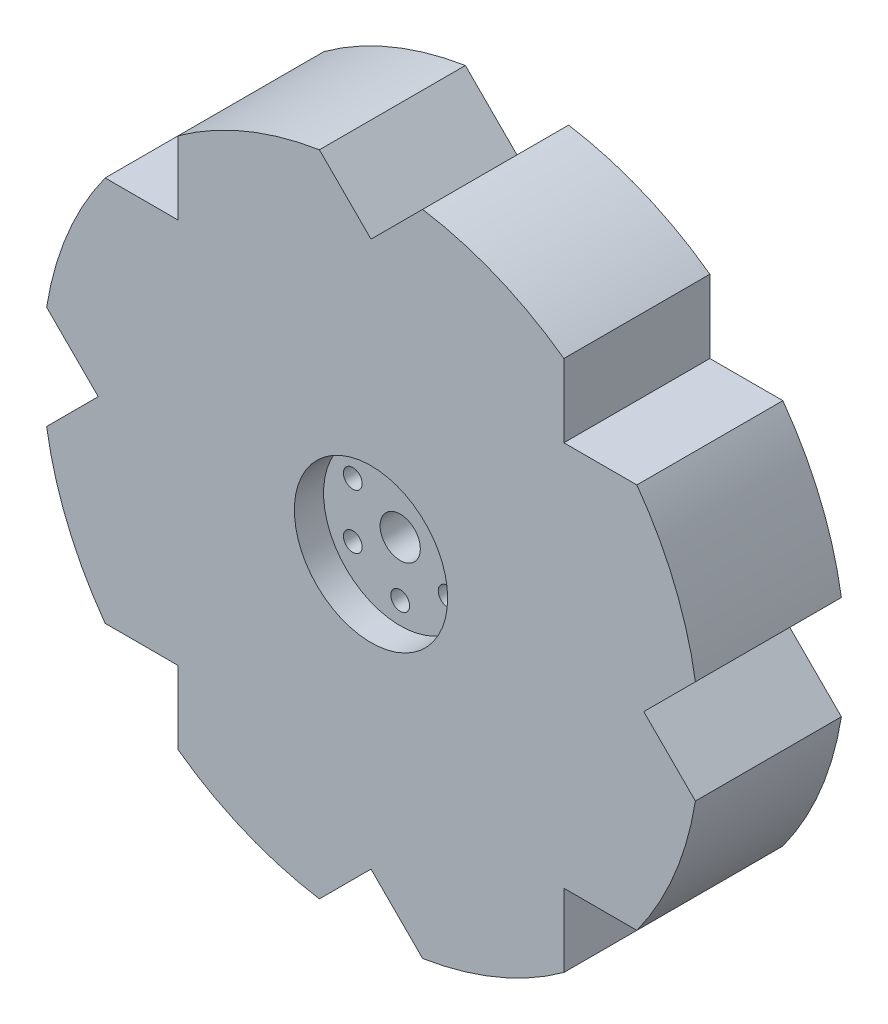
ISO-10303-21;
HEADER;
FILE_DESCRIPTION(('STEP AP214'),'2;1');
FILE_NAME('part.step','',(''),(''),'','','');
FILE_SCHEMA(('AUTOMOTIVE_DESIGN { 1 0 10303 214 1 1 1 1 }'));
ENDSEC;
DATA;
#1=APPLICATION_CONTEXT('core data for automotive mechanical design processes');
#2=APPLICATION_PROTOCOL_DEFINITION('international standard','automotive_design',2000,#1);
#3=PRODUCT_CONTEXT('',#1,'mechanical');
#4=PRODUCT('Part','Part','',(#3));
#5=PRODUCT_RELATED_PRODUCT_CATEGORY('part','',(#4));
#6=PRODUCT_DEFINITION_FORMATION('','',#4);
#7=PRODUCT_DEFINITION_CONTEXT('part definition',#1,'design');
#8=PRODUCT_DEFINITION('design','',#6,#7);
#9=PRODUCT_DEFINITION_SHAPE('','',#8);
#10=(LENGTH_UNIT() NAMED_UNIT(*) SI_UNIT(.MILLI.,.METRE.));
#11=(NAMED_UNIT(*) PLANE_ANGLE_UNIT() SI_UNIT($,.RADIAN.));
#12=(NAMED_UNIT(*) SI_UNIT($,.STERADIAN.) SOLID_ANGLE_UNIT());
#13=UNCERTAINTY_MEASURE_WITH_UNIT(LENGTH_MEASURE(1.E-05),#10,'distance_accuracy_value','');
#14=(GEOMETRIC_REPRESENTATION_CONTEXT(3) GLOBAL_UNCERTAINTY_ASSIGNED_CONTEXT((#13)) GLOBAL_UNIT_ASSIGNED_CONTEXT((#10,
#11,#12)) REPRESENTATION_CONTEXT('',''));
#15=CARTESIAN_POINT('',(0.,0.,0.));
#16=DIRECTION('',(0.,0.,1.));
#17=DIRECTION('',(1.,0.,0.));
#18=AXIS2_PLACEMENT_3D('',#15,#16,#17);
#19=CARTESIAN_POINT('',(0.,0.,0.));
#20=DIRECTION('',(0.,0.,1.));
#21=DIRECTION('',(1.,0.,0.));
#22=AXIS2_PLACEMENT_3D('',#19,#20,#21);
#23=CYLINDRICAL_SURFACE('',#22,3.5);
#24=CARTESIAN_POINT('',(0.,0.,20.32));
#25=DIRECTION('',(0.,0.,1.));
#26=DIRECTION('',(1.,0.,0.));
#27=AXIS2_PLACEMENT_3D('',#24,#25,#26);
#28=CIRCLE('',#27,3.5);
#29=CARTESIAN_POINT('',(3.5,0.,20.32));
#30=VERTEX_POINT('',#29);
#31=EDGE_CURVE('E232',#30,#30,#28,.F.);
#32=ORIENTED_EDGE('',*,*,#31,.F.);
#33=EDGE_LOOP('',(#32));
#34=FACE_BOUND('',#33,.T.);
#35=CARTESIAN_POINT('',(0.,0.,5.08));
#36=DIRECTION('',(0.,0.,-1.));
#37=DIRECTION('',(-1.,0.,0.));
#38=AXIS2_PLACEMENT_3D('',#35,#36,#37);
#39=CIRCLE('',#38,3.5);
#40=CARTESIAN_POINT('',(-3.5,0.,5.08));
#41=VERTEX_POINT('',#40);
#42=EDGE_CURVE('E338',#41,#41,#39,.F.);
#43=ORIENTED_EDGE('',*,*,#42,.F.);
#44=EDGE_LOOP('',(#43));
#45=FACE_BOUND('',#44,.T.);
#46=ADVANCED_FACE('F33',(#34,#45),#23,.F.);
#47=CARTESIAN_POINT('',(0.,0.,25.4));
#48=DIRECTION('',(0.,0.,-1.));
#49=DIRECTION('',(-1.,0.,0.));
#50=AXIS2_PLACEMENT_3D('',#47,#48,#49);
#51=CYLINDRICAL_SURFACE('',#50,57.15);
#52=CARTESIAN_POINT('',(0.,0.,0.));
#53=DIRECTION('',(0.,0.,1.));
#54=DIRECTION('',(1.,0.,0.));
#55=AXIS2_PLACEMENT_3D('',#52,#53,#54);
#56=CIRCLE('',#55,57.15);
#57=CARTESIAN_POINT('',(-8.98025612106911,56.440034549954,0.));
#58=VERTEX_POINT('',#57);
#59=CARTESIAN_POINT('',(-33.5591311606754,46.2591311606756,0.));
#60=VERTEX_POINT('',#59);
#61=EDGE_CURVE('E228',#58,#60,#56,.T.);
#62=ORIENTED_EDGE('',*,*,#61,.T.);
#63=DIRECTION('',(0.,0.,-1.));
#64=VECTOR('',#63,1.);
#65=CARTESIAN_POINT('',(-33.5591311606754,46.2591311606756,25.4));
#66=LINE('',#65,#64);
#67=CARTESIAN_POINT('',(-33.5591311606754,46.2591311606756,25.4));
#68=VERTEX_POINT('',#67);
#69=EDGE_CURVE('E11',#68,#60,#66,.T.);
#70=ORIENTED_EDGE('',*,*,#69,.F.);
#71=CARTESIAN_POINT('',(0.,0.,25.4));
#72=DIRECTION('',(0.,0.,1.));
#73=DIRECTION('',(1.,0.,0.));
#74=AXIS2_PLACEMENT_3D('',#71,#72,#73);
#75=CIRCLE('',#74,57.15);
#76=CARTESIAN_POINT('',(-8.98025612106911,56.440034549954,25.4));
#77=VERTEX_POINT('',#76);
#78=EDGE_CURVE('E275',#77,#68,#75,.T.);
#79=ORIENTED_EDGE('',*,*,#78,.F.);
#80=DIRECTION('',(0.,0.,-1.));
#81=VECTOR('',#80,1.);
#82=CARTESIAN_POINT('',(-8.98025612106911,56.440034549954,25.4));
#83=LINE('',#82,#81);
#84=EDGE_CURVE('E224',#77,#58,#83,.T.);
#85=ORIENTED_EDGE('',*,*,#84,.T.);
#86=EDGE_LOOP('',(#62,#70,#79,#85));
#87=FACE_BOUND('',#86,.T.);
#88=ADVANCED_FACE('F35',(#87),#51,.T.);
#89=CARTESIAN_POINT('',(-33.5591311606755,33.5591311606755,25.4));
#90=DIRECTION('',(1.,0.,0.));
#91=DIRECTION('',(0.,1.,0.));
#92=AXIS2_PLACEMENT_3D('',#89,#90,#91);
#93=PLANE('',#92);
#94=DIRECTION('',(0.,-1.,0.));
#95=VECTOR('',#94,1.);
#96=CARTESIAN_POINT('',(-33.5591311606755,33.5591311606755,0.));
#97=LINE('',#96,#95);
#98=CARTESIAN_POINT('',(-33.5591311606755,33.5591311606755,0.));
#99=VERTEX_POINT('',#98);
#100=EDGE_CURVE('E231',#60,#99,#97,.T.);
#101=ORIENTED_EDGE('',*,*,#100,.T.);
#102=DIRECTION('',(0.,0.,-1.));
#103=VECTOR('',#102,1.);
#104=CARTESIAN_POINT('',(-33.5591311606755,33.5591311606755,25.4));
#105=LINE('',#104,#103);
#106=CARTESIAN_POINT('',(-33.5591311606755,33.5591311606755,25.4));
#107=VERTEX_POINT('',#106);
#108=EDGE_CURVE('E43',#107,#99,#105,.T.);
#109=ORIENTED_EDGE('',*,*,#108,.F.);
#110=DIRECTION('',(0.,-1.,0.));
#111=VECTOR('',#110,1.);
#112=CARTESIAN_POINT('',(-33.5591311606755,33.5591311606755,25.4));
#113=LINE('',#112,#111);
#114=EDGE_CURVE('E143',#68,#107,#113,.T.);
#115=ORIENTED_EDGE('',*,*,#114,.F.);
#116=ORIENTED_EDGE('',*,*,#69,.T.);
#117=EDGE_LOOP('',(#101,#109,#115,#116));
#118=FACE_BOUND('',#117,.T.);
#119=ADVANCED_FACE('F443',(#118),#93,.F.);
#120=CARTESIAN_POINT('',(-46.2591311606755,33.5591311606755,25.4));
#121=DIRECTION('',(0.,-1.,0.));
#122=DIRECTION('',(1.,0.,0.));
#123=AXIS2_PLACEMENT_3D('',#120,#121,#122);
#124=PLANE('',#123);
#125=DIRECTION('',(-1.,0.,0.));
#126=VECTOR('',#125,1.);
#127=CARTESIAN_POINT('',(-46.2591311606755,33.5591311606755,0.));
#128=LINE('',#127,#126);
#129=CARTESIAN_POINT('',(-46.2591311606755,33.5591311606755,0.));
#130=VERTEX_POINT('',#129);
#131=EDGE_CURVE('E234',#99,#130,#128,.T.);
#132=ORIENTED_EDGE('',*,*,#131,.T.);
#133=DIRECTION('',(0.,0.,-1.));
#134=VECTOR('',#133,1.);
#135=CARTESIAN_POINT('',(-46.2591311606755,33.5591311606755,25.4));
#136=LINE('',#135,#134);
#137=CARTESIAN_POINT('',(-46.2591311606755,33.5591311606755,25.4));
#138=VERTEX_POINT('',#137);
#139=EDGE_CURVE('E330',#138,#130,#136,.T.);
#140=ORIENTED_EDGE('',*,*,#139,.F.);
#141=DIRECTION('',(-1.,0.,0.));
#142=VECTOR('',#141,1.);
#143=CARTESIAN_POINT('',(-46.2591311606755,33.5591311606755,25.4));
#144=LINE('',#143,#142);
#145=EDGE_CURVE('E374',#107,#138,#144,.T.);
#146=ORIENTED_EDGE('',*,*,#145,.F.);
#147=ORIENTED_EDGE('',*,*,#108,.T.);
#148=EDGE_LOOP('',(#132,#140,#146,#147));
#149=FACE_BOUND('',#148,.T.);
#150=ADVANCED_FACE('F779',(#149),#124,.F.);
#151=CARTESIAN_POINT('',(0.,0.,25.4));
#152=DIRECTION('',(0.,0.,-1.));
#153=DIRECTION('',(-1.,0.,0.));
#154=AXIS2_PLACEMENT_3D('',#151,#152,#153);
#155=CYLINDRICAL_SURFACE('',#154,57.15);
#156=CARTESIAN_POINT('',(0.,0.,0.));
#157=DIRECTION('',(0.,0.,1.));
#158=DIRECTION('',(1.,0.,0.));
#159=AXIS2_PLACEMENT_3D('',#156,#157,#158);
#160=CIRCLE('',#159,57.15);
#161=CARTESIAN_POINT('',(-56.440034549954,8.98025612106925,0.));
#162=VERTEX_POINT('',#161);
#163=EDGE_CURVE('E236',#130,#162,#160,.T.);
#164=ORIENTED_EDGE('',*,*,#163,.T.);
#165=DIRECTION('',(0.,0.,-1.));
#166=VECTOR('',#165,1.);
#167=CARTESIAN_POINT('',(-56.440034549954,8.98025612106925,25.4));
#168=LINE('',#167,#166);
#169=CARTESIAN_POINT('',(-56.440034549954,8.98025612106925,25.4));
#170=VERTEX_POINT('',#169);
#171=EDGE_CURVE('E327',#170,#162,#168,.T.);
#172=ORIENTED_EDGE('',*,*,#171,.F.);
#173=CARTESIAN_POINT('',(0.,0.,25.4));
#174=DIRECTION('',(0.,0.,1.));
#175=DIRECTION('',(1.,0.,0.));
#176=AXIS2_PLACEMENT_3D('',#173,#174,#175);
#177=CIRCLE('',#176,57.15);
#178=EDGE_CURVE('E376',#138,#170,#177,.T.);
#179=ORIENTED_EDGE('',*,*,#178,.F.);
#180=ORIENTED_EDGE('',*,*,#139,.T.);
#181=EDGE_LOOP('',(#164,#172,#179,#180));
#182=FACE_BOUND('',#181,.T.);
#183=ADVANCED_FACE('F770',(#182),#155,.T.);
#184=CARTESIAN_POINT('',(-47.4597784288848,0.,25.4));
#185=DIRECTION('',(0.707106781186551,0.707106781186544,0.));
#186=DIRECTION('',(-0.707106781186544,0.707106781186551,0.));
#187=AXIS2_PLACEMENT_3D('',#184,#185,#186);
#188=PLANE('',#187);
#189=DIRECTION('',(0.707106781186544,-0.707106781186551,0.));
#190=VECTOR('',#189,1.);
#191=CARTESIAN_POINT('',(-47.4597784288848,0.,0.));
#192=LINE('',#191,#190);
#193=CARTESIAN_POINT('',(-47.4597784288848,0.,0.));
#194=VERTEX_POINT('',#193);
#195=EDGE_CURVE('E238',#162,#194,#192,.T.);
#196=ORIENTED_EDGE('',*,*,#195,.T.);
#197=DIRECTION('',(0.,0.,-1.));
#198=VECTOR('',#197,1.);
#199=CARTESIAN_POINT('',(-47.4597784288848,0.,25.4));
#200=LINE('',#199,#198);
#201=CARTESIAN_POINT('',(-47.4597784288848,0.,25.4));
#202=VERTEX_POINT('',#201);
#203=EDGE_CURVE('E324',#202,#194,#200,.T.);
#204=ORIENTED_EDGE('',*,*,#203,.F.);
#205=DIRECTION('',(0.707106781186544,-0.707106781186551,0.));
#206=VECTOR('',#205,1.);
#207=CARTESIAN_POINT('',(-47.4597784288848,0.,25.4));
#208=LINE('',#207,#206);
#209=EDGE_CURVE('E378',#170,#202,#208,.T.);
#210=ORIENTED_EDGE('',*,*,#209,.F.);
#211=ORIENTED_EDGE('',*,*,#171,.T.);
#212=EDGE_LOOP('',(#196,#204,#210,#211));
#213=FACE_BOUND('',#212,.T.);
#214=ADVANCED_FACE('F761',(#213),#188,.F.);
#215=CARTESIAN_POINT('',(-56.440034549954,-8.98025612106912,25.4));
#216=DIRECTION('',(0.707106781186544,-0.707106781186551,0.));
#217=DIRECTION('',(0.707106781186551,0.707106781186544,0.));
#218=AXIS2_PLACEMENT_3D('',#215,#216,#217);
#219=PLANE('',#218);
#220=DIRECTION('',(-0.707106781186551,-0.707106781186544,0.));
#221=VECTOR('',#220,1.);
#222=CARTESIAN_POINT('',(-56.440034549954,-8.98025612106912,0.));
#223=LINE('',#222,#221);
#224=CARTESIAN_POINT('',(-56.440034549954,-8.9802561210691,0.));
#225=VERTEX_POINT('',#224);
#226=EDGE_CURVE('E240',#194,#225,#223,.T.);
#227=ORIENTED_EDGE('',*,*,#226,.T.);
#228=DIRECTION('',(0.,0.,-1.));
#229=VECTOR('',#228,1.);
#230=CARTESIAN_POINT('',(-56.440034549954,-8.9802561210691,25.4));
#231=LINE('',#230,#229);
#232=CARTESIAN_POINT('',(-56.440034549954,-8.9802561210691,25.4));
#233=VERTEX_POINT('',#232);
#234=EDGE_CURVE('E321',#233,#225,#231,.T.);
#235=ORIENTED_EDGE('',*,*,#234,.F.);
#236=DIRECTION('',(-0.707106781186551,-0.707106781186544,0.));
#237=VECTOR('',#236,1.);
#238=CARTESIAN_POINT('',(-56.440034549954,-8.98025612106912,25.4));
#239=LINE('',#238,#237);
#240=EDGE_CURVE('E380',#202,#233,#239,.T.);
#241=ORIENTED_EDGE('',*,*,#240,.F.);
#242=ORIENTED_EDGE('',*,*,#203,.T.);
#243=EDGE_LOOP('',(#227,#235,#241,#242));
#244=FACE_BOUND('',#243,.T.);
#245=ADVANCED_FACE('F752',(#244),#219,.F.);
#246=CARTESIAN_POINT('',(0.,0.,25.4));
#247=DIRECTION('',(0.,0.,-1.));
#248=DIRECTION('',(-1.,0.,0.));
#249=AXIS2_PLACEMENT_3D('',#246,#247,#248);
#250=CYLINDRICAL_SURFACE('',#249,57.15);
#251=CARTESIAN_POINT('',(0.,0.,0.));
#252=DIRECTION('',(0.,0.,1.));
#253=DIRECTION('',(1.,0.,0.));
#254=AXIS2_PLACEMENT_3D('',#251,#252,#253);
#255=CIRCLE('',#254,57.15);
#256=CARTESIAN_POINT('',(-46.2591311606756,-33.5591311606754,0.));
#257=VERTEX_POINT('',#256);
#258=EDGE_CURVE('E242',#225,#257,#255,.T.);
#259=ORIENTED_EDGE('',*,*,#258,.T.);
#260=DIRECTION('',(0.,0.,-1.));
#261=VECTOR('',#260,1.);
#262=CARTESIAN_POINT('',(-46.2591311606756,-33.5591311606754,25.4));
#263=LINE('',#262,#261);
#264=CARTESIAN_POINT('',(-46.2591311606756,-33.5591311606754,25.4));
#265=VERTEX_POINT('',#264);
#266=EDGE_CURVE('E318',#265,#257,#263,.T.);
#267=ORIENTED_EDGE('',*,*,#266,.F.);
#268=CARTESIAN_POINT('',(0.,0.,25.4));
#269=DIRECTION('',(0.,0.,1.));
#270=DIRECTION('',(1.,0.,0.));
#271=AXIS2_PLACEMENT_3D('',#268,#269,#270);
#272=CIRCLE('',#271,57.15);
#273=EDGE_CURVE('E382',#233,#265,#272,.T.);
#274=ORIENTED_EDGE('',*,*,#273,.F.);
#275=ORIENTED_EDGE('',*,*,#234,.T.);
#276=EDGE_LOOP('',(#259,#267,#274,#275));
#277=FACE_BOUND('',#276,.T.);
#278=ADVANCED_FACE('F743',(#277),#250,.T.);
#279=CARTESIAN_POINT('',(-33.5591311606755,-33.5591311606755,25.4));
#280=DIRECTION('',(0.,1.,0.));
#281=DIRECTION('',(-1.,0.,0.));
#282=AXIS2_PLACEMENT_3D('',#279,#280,#281);
#283=PLANE('',#282);
#284=DIRECTION('',(1.,0.,0.));
#285=VECTOR('',#284,1.);
#286=CARTESIAN_POINT('',(-33.5591311606755,-33.5591311606755,0.));
#287=LINE('',#286,#285);
#288=CARTESIAN_POINT('',(-33.5591311606755,-33.5591311606755,0.));
#289=VERTEX_POINT('',#288);
#290=EDGE_CURVE('E244',#257,#289,#287,.T.);
#291=ORIENTED_EDGE('',*,*,#290,.T.);
#292=DIRECTION('',(0.,0.,-1.));
#293=VECTOR('',#292,1.);
#294=CARTESIAN_POINT('',(-33.5591311606755,-33.5591311606755,25.4));
#295=LINE('',#294,#293);
#296=CARTESIAN_POINT('',(-33.5591311606755,-33.5591311606755,25.4));
#297=VERTEX_POINT('',#296);
#298=EDGE_CURVE('E315',#297,#289,#295,.T.);
#299=ORIENTED_EDGE('',*,*,#298,.F.);
#300=DIRECTION('',(1.,0.,0.));
#301=VECTOR('',#300,1.);
#302=CARTESIAN_POINT('',(-33.5591311606755,-33.5591311606755,25.4));
#303=LINE('',#302,#301);
#304=EDGE_CURVE('E384',#265,#297,#303,.T.);
#305=ORIENTED_EDGE('',*,*,#304,.F.);
#306=ORIENTED_EDGE('',*,*,#266,.T.);
#307=EDGE_LOOP('',(#291,#299,#305,#306));
#308=FACE_BOUND('',#307,.T.);
#309=ADVANCED_FACE('F734',(#308),#283,.F.);
#310=CARTESIAN_POINT('',(-33.5591311606755,-46.2591311606755,25.4));
#311=DIRECTION('',(1.,0.,0.));
#312=DIRECTION('',(0.,1.,0.));
#313=AXIS2_PLACEMENT_3D('',#310,#311,#312);
#314=PLANE('',#313);
#315=DIRECTION('',(0.,-1.,0.));
#316=VECTOR('',#315,1.);
#317=CARTESIAN_POINT('',(-33.5591311606755,-46.2591311606755,0.));
#318=LINE('',#317,#316);
#319=CARTESIAN_POINT('',(-33.5591311606755,-46.2591311606755,0.));
#320=VERTEX_POINT('',#319);
#321=EDGE_CURVE('E246',#289,#320,#318,.T.);
#322=ORIENTED_EDGE('',*,*,#321,.T.);
#323=DIRECTION('',(0.,0.,-1.));
#324=VECTOR('',#323,1.);
#325=CARTESIAN_POINT('',(-33.5591311606755,-46.2591311606755,25.4));
#326=LINE('',#325,#324);
#327=CARTESIAN_POINT('',(-33.5591311606755,-46.2591311606755,25.4));
#328=VERTEX_POINT('',#327);
#329=EDGE_CURVE('E312',#328,#320,#326,.T.);
#330=ORIENTED_EDGE('',*,*,#329,.F.);
#331=DIRECTION('',(0.,-1.,0.));
#332=VECTOR('',#331,1.);
#333=CARTESIAN_POINT('',(-33.5591311606755,-46.2591311606755,25.4));
#334=LINE('',#333,#332);
#335=EDGE_CURVE('E386',#297,#328,#334,.T.);
#336=ORIENTED_EDGE('',*,*,#335,.F.);
#337=ORIENTED_EDGE('',*,*,#298,.T.);
#338=EDGE_LOOP('',(#322,#330,#336,#337));
#339=FACE_BOUND('',#338,.T.);
#340=ADVANCED_FACE('F725',(#339),#314,.F.);
#341=CARTESIAN_POINT('',(0.,0.,25.4));
#342=DIRECTION('',(0.,0.,-1.));
#343=DIRECTION('',(-1.,0.,0.));
#344=AXIS2_PLACEMENT_3D('',#341,#342,#343);
#345=CYLINDRICAL_SURFACE('',#344,57.15);
#346=CARTESIAN_POINT('',(0.,0.,0.));
#347=DIRECTION('',(0.,0.,1.));
#348=DIRECTION('',(1.,0.,0.));
#349=AXIS2_PLACEMENT_3D('',#346,#347,#348);
#350=CIRCLE('',#349,57.15);
#351=CARTESIAN_POINT('',(-8.98025612106926,-56.440034549954,0.));
#352=VERTEX_POINT('',#351);
#353=EDGE_CURVE('E248',#320,#352,#350,.T.);
#354=ORIENTED_EDGE('',*,*,#353,.T.);
#355=DIRECTION('',(0.,0.,-1.));
#356=VECTOR('',#355,1.);
#357=CARTESIAN_POINT('',(-8.98025612106926,-56.440034549954,25.4));
#358=LINE('',#357,#356);
#359=CARTESIAN_POINT('',(-8.98025612106926,-56.440034549954,25.4));
#360=VERTEX_POINT('',#359);
#361=EDGE_CURVE('E309',#360,#352,#358,.T.);
#362=ORIENTED_EDGE('',*,*,#361,.F.);
#363=CARTESIAN_POINT('',(0.,0.,25.4));
#364=DIRECTION('',(0.,0.,1.));
#365=DIRECTION('',(1.,0.,0.));
#366=AXIS2_PLACEMENT_3D('',#363,#364,#365);
#367=CIRCLE('',#366,57.15);
#368=EDGE_CURVE('E388',#328,#360,#367,.T.);
#369=ORIENTED_EDGE('',*,*,#368,.F.);
#370=ORIENTED_EDGE('',*,*,#329,.T.);
#371=EDGE_LOOP('',(#354,#362,#369,#370));
#372=FACE_BOUND('',#371,.T.);
#373=ADVANCED_FACE('F716',(#372),#345,.T.);
#374=CARTESIAN_POINT('',(0.,-47.4597784288848,25.4));
#375=DIRECTION('',(-0.707106781186544,0.707106781186551,0.));
#376=DIRECTION('',(-0.707106781186551,-0.707106781186544,0.));
#377=AXIS2_PLACEMENT_3D('',#374,#375,#376);
#378=PLANE('',#377);
#379=DIRECTION('',(0.707106781186551,0.707106781186544,0.));
#380=VECTOR('',#379,1.);
#381=CARTESIAN_POINT('',(0.,-47.4597784288848,0.));
#382=LINE('',#381,#380);
#383=CARTESIAN_POINT('',(0.,-47.4597784288848,0.));
#384=VERTEX_POINT('',#383);
#385=EDGE_CURVE('E250',#352,#384,#382,.T.);
#386=ORIENTED_EDGE('',*,*,#385,.T.);
#387=DIRECTION('',(0.,0.,-1.));
#388=VECTOR('',#387,1.);
#389=CARTESIAN_POINT('',(0.,-47.4597784288848,25.4));
#390=LINE('',#389,#388);
#391=CARTESIAN_POINT('',(0.,-47.4597784288848,25.4));
#392=VERTEX_POINT('',#391);
#393=EDGE_CURVE('E306',#392,#384,#390,.T.);
#394=ORIENTED_EDGE('',*,*,#393,.F.);
#395=DIRECTION('',(0.707106781186551,0.707106781186544,0.));
#396=VECTOR('',#395,1.);
#397=CARTESIAN_POINT('',(0.,-47.4597784288848,25.4));
#398=LINE('',#397,#396);
#399=EDGE_CURVE('E390',#360,#392,#398,.T.);
#400=ORIENTED_EDGE('',*,*,#399,.F.);
#401=ORIENTED_EDGE('',*,*,#361,.T.);
#402=EDGE_LOOP('',(#386,#394,#400,#401));
#403=FACE_BOUND('',#402,.T.);
#404=ADVANCED_FACE('F707',(#403),#378,.F.);
#405=CARTESIAN_POINT('',(8.98025612106911,-56.440034549954,25.4));
#406=DIRECTION('',(0.707106781186551,0.707106781186543,0.));
#407=DIRECTION('',(-0.707106781186544,0.707106781186552,0.));
#408=AXIS2_PLACEMENT_3D('',#405,#406,#407);
#409=PLANE('',#408);
#410=DIRECTION('',(0.707106781186543,-0.707106781186551,0.));
#411=VECTOR('',#410,1.);
#412=CARTESIAN_POINT('',(8.98025612106911,-56.440034549954,0.));
#413=LINE('',#412,#411);
#414=CARTESIAN_POINT('',(8.98025612106909,-56.440034549954,0.));
#415=VERTEX_POINT('',#414);
#416=EDGE_CURVE('E252',#384,#415,#413,.T.);
#417=ORIENTED_EDGE('',*,*,#416,.T.);
#418=DIRECTION('',(0.,0.,-1.));
#419=VECTOR('',#418,1.);
#420=CARTESIAN_POINT('',(8.98025612106909,-56.440034549954,25.4));
#421=LINE('',#420,#419);
#422=CARTESIAN_POINT('',(8.98025612106909,-56.440034549954,25.4));
#423=VERTEX_POINT('',#422);
#424=EDGE_CURVE('E303',#423,#415,#421,.T.);
#425=ORIENTED_EDGE('',*,*,#424,.F.);
#426=DIRECTION('',(0.707106781186543,-0.707106781186551,0.));
#427=VECTOR('',#426,1.);
#428=CARTESIAN_POINT('',(8.98025612106911,-56.440034549954,25.4));
#429=LINE('',#428,#427);
#430=EDGE_CURVE('E392',#392,#423,#429,.T.);
#431=ORIENTED_EDGE('',*,*,#430,.F.);
#432=ORIENTED_EDGE('',*,*,#393,.T.);
#433=EDGE_LOOP('',(#417,#425,#431,#432));
#434=FACE_BOUND('',#433,.T.);
#435=ADVANCED_FACE('F698',(#434),#409,.F.);
#436=CARTESIAN_POINT('',(0.,0.,25.4));
#437=DIRECTION('',(0.,0.,-1.));
#438=DIRECTION('',(-1.,0.,0.));
#439=AXIS2_PLACEMENT_3D('',#436,#437,#438);
#440=CYLINDRICAL_SURFACE('',#439,57.15);
#441=CARTESIAN_POINT('',(0.,0.,0.));
#442=DIRECTION('',(0.,0.,1.));
#443=DIRECTION('',(1.,0.,0.));
#444=AXIS2_PLACEMENT_3D('',#441,#442,#443);
#445=CIRCLE('',#444,57.15);
#446=CARTESIAN_POINT('',(33.5591311606754,-46.2591311606756,0.));
#447=VERTEX_POINT('',#446);
#448=EDGE_CURVE('E254',#415,#447,#445,.T.);
#449=ORIENTED_EDGE('',*,*,#448,.T.);
#450=DIRECTION('',(0.,0.,-1.));
#451=VECTOR('',#450,1.);
#452=CARTESIAN_POINT('',(33.5591311606754,-46.2591311606756,25.4));
#453=LINE('',#452,#451);
#454=CARTESIAN_POINT('',(33.5591311606754,-46.2591311606756,25.4));
#455=VERTEX_POINT('',#454);
#456=EDGE_CURVE('E300',#455,#447,#453,.T.);
#457=ORIENTED_EDGE('',*,*,#456,.F.);
#458=CARTESIAN_POINT('',(0.,0.,25.4));
#459=DIRECTION('',(0.,0.,1.));
#460=DIRECTION('',(1.,0.,0.));
#461=AXIS2_PLACEMENT_3D('',#458,#459,#460);
#462=CIRCLE('',#461,57.15);
#463=EDGE_CURVE('E394',#423,#455,#462,.T.);
#464=ORIENTED_EDGE('',*,*,#463,.F.);
#465=ORIENTED_EDGE('',*,*,#424,.T.);
#466=EDGE_LOOP('',(#449,#457,#464,#465));
#467=FACE_BOUND('',#466,.T.);
#468=ADVANCED_FACE('F689',(#467),#440,.T.);
#469=CARTESIAN_POINT('',(33.5591311606755,-33.5591311606755,25.4));
#470=DIRECTION('',(-1.,0.,0.));
#471=DIRECTION('',(0.,-1.,0.));
#472=AXIS2_PLACEMENT_3D('',#469,#470,#471);
#473=PLANE('',#472);
#474=DIRECTION('',(0.,1.,0.));
#475=VECTOR('',#474,1.);
#476=CARTESIAN_POINT('',(33.5591311606755,-33.5591311606755,0.));
#477=LINE('',#476,#475);
#478=CARTESIAN_POINT('',(33.5591311606755,-33.5591311606755,0.));
#479=VERTEX_POINT('',#478);
#480=EDGE_CURVE('E256',#447,#479,#477,.T.);
#481=ORIENTED_EDGE('',*,*,#480,.T.);
#482=DIRECTION('',(0.,0.,-1.));
#483=VECTOR('',#482,1.);
#484=CARTESIAN_POINT('',(33.5591311606755,-33.5591311606755,25.4));
#485=LINE('',#484,#483);
#486=CARTESIAN_POINT('',(33.5591311606755,-33.5591311606755,25.4));
#487=VERTEX_POINT('',#486);
#488=EDGE_CURVE('E297',#487,#479,#485,.T.);
#489=ORIENTED_EDGE('',*,*,#488,.F.);
#490=DIRECTION('',(0.,1.,0.));
#491=VECTOR('',#490,1.);
#492=CARTESIAN_POINT('',(33.5591311606755,-33.5591311606755,25.4));
#493=LINE('',#492,#491);
#494=EDGE_CURVE('E396',#455,#487,#493,.T.);
#495=ORIENTED_EDGE('',*,*,#494,.F.);
#496=ORIENTED_EDGE('',*,*,#456,.T.);
#497=EDGE_LOOP('',(#481,#489,#495,#496));
#498=FACE_BOUND('',#497,.T.);
#499=ADVANCED_FACE('F680',(#498),#473,.F.);
#500=CARTESIAN_POINT('',(46.2591311606755,-33.5591311606755,25.4));
#501=DIRECTION('',(0.,1.,0.));
#502=DIRECTION('',(-1.,0.,0.));
#503=AXIS2_PLACEMENT_3D('',#500,#501,#502);
#504=PLANE('',#503);
#505=DIRECTION('',(1.,0.,0.));
#506=VECTOR('',#505,1.);
#507=CARTESIAN_POINT('',(46.2591311606755,-33.5591311606755,0.));
#508=LINE('',#507,#506);
#509=CARTESIAN_POINT('',(46.2591311606755,-33.5591311606755,0.));
#510=VERTEX_POINT('',#509);
#511=EDGE_CURVE('E258',#479,#510,#508,.T.);
#512=ORIENTED_EDGE('',*,*,#511,.T.);
#513=DIRECTION('',(0.,0.,-1.));
#514=VECTOR('',#513,1.);
#515=CARTESIAN_POINT('',(46.2591311606755,-33.5591311606755,25.4));
#516=LINE('',#515,#514);
#517=CARTESIAN_POINT('',(46.2591311606755,-33.5591311606755,25.4));
#518=VERTEX_POINT('',#517);
#519=EDGE_CURVE('E294',#518,#510,#516,.T.);
#520=ORIENTED_EDGE('',*,*,#519,.F.);
#521=DIRECTION('',(1.,0.,0.));
#522=VECTOR('',#521,1.);
#523=CARTESIAN_POINT('',(46.2591311606755,-33.5591311606755,25.4));
#524=LINE('',#523,#522);
#525=EDGE_CURVE('E398',#487,#518,#524,.T.);
#526=ORIENTED_EDGE('',*,*,#525,.F.);
#527=ORIENTED_EDGE('',*,*,#488,.T.);
#528=EDGE_LOOP('',(#512,#520,#526,#527));
#529=FACE_BOUND('',#528,.T.);
#530=ADVANCED_FACE('F671',(#529),#504,.F.);
#531=CARTESIAN_POINT('',(0.,0.,25.4));
#532=DIRECTION('',(0.,0.,-1.));
#533=DIRECTION('',(-1.,0.,0.));
#534=AXIS2_PLACEMENT_3D('',#531,#532,#533);
#535=CYLINDRICAL_SURFACE('',#534,57.15);
#536=CARTESIAN_POINT('',(0.,0.,0.));
#537=DIRECTION('',(0.,0.,1.));
#538=DIRECTION('',(1.,0.,0.));
#539=AXIS2_PLACEMENT_3D('',#536,#537,#538);
#540=CIRCLE('',#539,57.15);
#541=CARTESIAN_POINT('',(56.440034549954,-8.98025612106926,0.));
#542=VERTEX_POINT('',#541);
#543=EDGE_CURVE('E260',#510,#542,#540,.T.);
#544=ORIENTED_EDGE('',*,*,#543,.T.);
#545=DIRECTION('',(0.,0.,-1.));
#546=VECTOR('',#545,1.);
#547=CARTESIAN_POINT('',(56.440034549954,-8.98025612106926,25.4));
#548=LINE('',#547,#546);
#549=CARTESIAN_POINT('',(56.440034549954,-8.98025612106926,25.4));
#550=VERTEX_POINT('',#549);
#551=EDGE_CURVE('E291',#550,#542,#548,.T.);
#552=ORIENTED_EDGE('',*,*,#551,.F.);
#553=CARTESIAN_POINT('',(0.,0.,25.4));
#554=DIRECTION('',(0.,0.,1.));
#555=DIRECTION('',(1.,0.,0.));
#556=AXIS2_PLACEMENT_3D('',#553,#554,#555);
#557=CIRCLE('',#556,57.15);
#558=EDGE_CURVE('E400',#518,#550,#557,.T.);
#559=ORIENTED_EDGE('',*,*,#558,.F.);
#560=ORIENTED_EDGE('',*,*,#519,.T.);
#561=EDGE_LOOP('',(#544,#552,#559,#560));
#562=FACE_BOUND('',#561,.T.);
#563=ADVANCED_FACE('F662',(#562),#535,.T.);
#564=CARTESIAN_POINT('',(47.4597784288848,0.,25.4));
#565=DIRECTION('',(-0.707106781186551,-0.707106781186544,0.));
#566=DIRECTION('',(0.707106781186544,-0.707106781186551,0.));
#567=AXIS2_PLACEMENT_3D('',#564,#565,#566);
#568=PLANE('',#567);
#569=DIRECTION('',(-0.707106781186544,0.707106781186551,0.));
#570=VECTOR('',#569,1.);
#571=CARTESIAN_POINT('',(47.4597784288848,0.,0.));
#572=LINE('',#571,#570);
#573=CARTESIAN_POINT('',(47.4597784288848,0.,0.));
#574=VERTEX_POINT('',#573);
#575=EDGE_CURVE('E262',#542,#574,#572,.T.);
#576=ORIENTED_EDGE('',*,*,#575,.T.);
#577=DIRECTION('',(0.,0.,-1.));
#578=VECTOR('',#577,1.);
#579=CARTESIAN_POINT('',(47.4597784288848,0.,25.4));
#580=LINE('',#579,#578);
#581=CARTESIAN_POINT('',(47.4597784288848,0.,25.4));
#582=VERTEX_POINT('',#581);
#583=EDGE_CURVE('E288',#582,#574,#580,.T.);
#584=ORIENTED_EDGE('',*,*,#583,.F.);
#585=DIRECTION('',(-0.707106781186544,0.707106781186551,0.));
#586=VECTOR('',#585,1.);
#587=CARTESIAN_POINT('',(47.4597784288848,0.,25.4));
#588=LINE('',#587,#586);
#589=EDGE_CURVE('E402',#550,#582,#588,.T.);
#590=ORIENTED_EDGE('',*,*,#589,.F.);
#591=ORIENTED_EDGE('',*,*,#551,.T.);
#592=EDGE_LOOP('',(#576,#584,#590,#591));
#593=FACE_BOUND('',#592,.T.);
#594=ADVANCED_FACE('F653',(#593),#568,.F.);
#595=CARTESIAN_POINT('',(56.440034549954,8.98025612106911,25.4));
#596=DIRECTION('',(-0.707106781186544,0.707106781186551,0.));
#597=DIRECTION('',(-0.707106781186551,-0.707106781186544,0.));
#598=AXIS2_PLACEMENT_3D('',#595,#596,#597);
#599=PLANE('',#598);
#600=DIRECTION('',(0.707106781186551,0.707106781186544,0.));
#601=VECTOR('',#600,1.);
#602=CARTESIAN_POINT('',(56.440034549954,8.98025612106911,0.));
#603=LINE('',#602,#601);
#604=CARTESIAN_POINT('',(56.440034549954,8.98025612106911,0.));
#605=VERTEX_POINT('',#604);
#606=EDGE_CURVE('E264',#574,#605,#603,.T.);
#607=ORIENTED_EDGE('',*,*,#606,.T.);
#608=DIRECTION('',(0.,0.,-1.));
#609=VECTOR('',#608,1.);
#610=CARTESIAN_POINT('',(56.440034549954,8.98025612106911,25.4));
#611=LINE('',#610,#609);
#612=CARTESIAN_POINT('',(56.440034549954,8.98025612106911,25.4));
#613=VERTEX_POINT('',#612);
#614=EDGE_CURVE('E285',#613,#605,#611,.T.);
#615=ORIENTED_EDGE('',*,*,#614,.F.);
#616=DIRECTION('',(0.707106781186551,0.707106781186544,0.));
#617=VECTOR('',#616,1.);
#618=CARTESIAN_POINT('',(56.440034549954,8.98025612106911,25.4));
#619=LINE('',#618,#617);
#620=EDGE_CURVE('E404',#582,#613,#619,.T.);
#621=ORIENTED_EDGE('',*,*,#620,.F.);
#622=ORIENTED_EDGE('',*,*,#583,.T.);
#623=EDGE_LOOP('',(#607,#615,#621,#622));
#624=FACE_BOUND('',#623,.T.);
#625=ADVANCED_FACE('F644',(#624),#599,.F.);
#626=CARTESIAN_POINT('',(0.,0.,25.4));
#627=DIRECTION('',(0.,0.,-1.));
#628=DIRECTION('',(-1.,0.,0.));
#629=AXIS2_PLACEMENT_3D('',#626,#627,#628);
#630=CYLINDRICAL_SURFACE('',#629,57.15);
#631=CARTESIAN_POINT('',(0.,0.,0.));
#632=DIRECTION('',(0.,0.,1.));
#633=DIRECTION('',(1.,0.,0.));
#634=AXIS2_PLACEMENT_3D('',#631,#632,#633);
#635=CIRCLE('',#634,57.15);
#636=CARTESIAN_POINT('',(46.2591311606756,33.5591311606754,0.));
#637=VERTEX_POINT('',#636);
#638=EDGE_CURVE('E266',#605,#637,#635,.T.);
#639=ORIENTED_EDGE('',*,*,#638,.T.);
#640=DIRECTION('',(0.,0.,-1.));
#641=VECTOR('',#640,1.);
#642=CARTESIAN_POINT('',(46.2591311606756,33.5591311606754,25.4));
#643=LINE('',#642,#641);
#644=CARTESIAN_POINT('',(46.2591311606756,33.5591311606754,25.4));
#645=VERTEX_POINT('',#644);
#646=EDGE_CURVE('E282',#645,#637,#643,.T.);
#647=ORIENTED_EDGE('',*,*,#646,.F.);
#648=CARTESIAN_POINT('',(0.,0.,25.4));
#649=DIRECTION('',(0.,0.,1.));
#650=DIRECTION('',(1.,0.,0.));
#651=AXIS2_PLACEMENT_3D('',#648,#649,#650);
#652=CIRCLE('',#651,57.15);
#653=EDGE_CURVE('E406',#613,#645,#652,.T.);
#654=ORIENTED_EDGE('',*,*,#653,.F.);
#655=ORIENTED_EDGE('',*,*,#614,.T.);
#656=EDGE_LOOP('',(#639,#647,#654,#655));
#657=FACE_BOUND('',#656,.T.);
#658=ADVANCED_FACE('F636',(#657),#630,.T.);
#659=CARTESIAN_POINT('',(33.5591311606755,33.5591311606755,25.4));
#660=DIRECTION('',(0.,-1.,0.));
#661=DIRECTION('',(1.,0.,0.));
#662=AXIS2_PLACEMENT_3D('',#659,#660,#661);
#663=PLANE('',#662);
#664=DIRECTION('',(-1.,0.,0.));
#665=VECTOR('',#664,1.);
#666=CARTESIAN_POINT('',(33.5591311606755,33.5591311606755,0.));
#667=LINE('',#666,#665);
#668=CARTESIAN_POINT('',(33.5591311606755,33.5591311606755,0.));
#669=VERTEX_POINT('',#668);
#670=EDGE_CURVE('E268',#637,#669,#667,.T.);
#671=ORIENTED_EDGE('',*,*,#670,.T.);
#672=DIRECTION('',(0.,0.,-1.));
#673=VECTOR('',#672,1.);
#674=CARTESIAN_POINT('',(33.5591311606755,33.5591311606755,25.4));
#675=LINE('',#674,#673);
#676=CARTESIAN_POINT('',(33.5591311606755,33.5591311606755,25.4));
#677=VERTEX_POINT('',#676);
#678=EDGE_CURVE('E279',#677,#669,#675,.T.);
#679=ORIENTED_EDGE('',*,*,#678,.F.);
#680=DIRECTION('',(-1.,0.,0.));
#681=VECTOR('',#680,1.);
#682=CARTESIAN_POINT('',(33.5591311606755,33.5591311606755,25.4));
#683=LINE('',#682,#681);
#684=EDGE_CURVE('E408',#645,#677,#683,.T.);
#685=ORIENTED_EDGE('',*,*,#684,.F.);
#686=ORIENTED_EDGE('',*,*,#646,.T.);
#687=EDGE_LOOP('',(#671,#679,#685,#686));
#688=FACE_BOUND('',#687,.T.);
#689=ADVANCED_FACE('F414',(#688),#663,.F.);
#690=CARTESIAN_POINT('',(33.5591311606755,46.2591311606755,25.4));
#691=DIRECTION('',(-1.,0.,0.));
#692=DIRECTION('',(0.,-1.,0.));
#693=AXIS2_PLACEMENT_3D('',#690,#691,#692);
#694=PLANE('',#693);
#695=DIRECTION('',(0.,1.,0.));
#696=VECTOR('',#695,1.);
#697=CARTESIAN_POINT('',(33.5591311606755,46.2591311606755,0.));
#698=LINE('',#697,#696);
#699=CARTESIAN_POINT('',(33.5591311606755,46.2591311606755,0.));
#700=VERTEX_POINT('',#699);
#701=EDGE_CURVE('E270',#669,#700,#698,.T.);
#702=ORIENTED_EDGE('',*,*,#701,.T.);
#703=DIRECTION('',(0.,0.,-1.));
#704=VECTOR('',#703,1.);
#705=CARTESIAN_POINT('',(33.5591311606755,46.2591311606755,25.4));
#706=LINE('',#705,#704);
#707=CARTESIAN_POINT('',(33.5591311606755,46.2591311606755,25.4));
#708=VERTEX_POINT('',#707);
#709=EDGE_CURVE('E219',#708,#700,#706,.T.);
#710=ORIENTED_EDGE('',*,*,#709,.F.);
#711=DIRECTION('',(0.,1.,0.));
#712=VECTOR('',#711,1.);
#713=CARTESIAN_POINT('',(33.5591311606755,46.2591311606755,25.4));
#714=LINE('',#713,#712);
#715=EDGE_CURVE('E210',#677,#708,#714,.T.);
#716=ORIENTED_EDGE('',*,*,#715,.F.);
#717=ORIENTED_EDGE('',*,*,#678,.T.);
#718=EDGE_LOOP('',(#702,#710,#716,#717));
#719=FACE_BOUND('',#718,.T.);
#720=ADVANCED_FACE('F418',(#719),#694,.F.);
#721=CARTESIAN_POINT('',(0.,0.,25.4));
#722=DIRECTION('',(0.,0.,-1.));
#723=DIRECTION('',(-1.,0.,0.));
#724=AXIS2_PLACEMENT_3D('',#721,#722,#723);
#725=CYLINDRICAL_SURFACE('',#724,57.15);
#726=CARTESIAN_POINT('',(0.,0.,0.));
#727=DIRECTION('',(0.,0.,1.));
#728=DIRECTION('',(1.,0.,0.));
#729=AXIS2_PLACEMENT_3D('',#726,#727,#728);
#730=CIRCLE('',#729,57.15);
#731=CARTESIAN_POINT('',(8.98025612106926,56.440034549954,0.));
#732=VERTEX_POINT('',#731);
#733=EDGE_CURVE('E218',#700,#732,#730,.T.);
#734=ORIENTED_EDGE('',*,*,#733,.T.);
#735=DIRECTION('',(0.,0.,-1.));
#736=VECTOR('',#735,1.);
#737=CARTESIAN_POINT('',(8.98025612106926,56.440034549954,25.4));
#738=LINE('',#737,#736);
#739=CARTESIAN_POINT('',(8.98025612106926,56.440034549954,25.4));
#740=VERTEX_POINT('',#739);
#741=EDGE_CURVE('E215',#740,#732,#738,.T.);
#742=ORIENTED_EDGE('',*,*,#741,.F.);
#743=CARTESIAN_POINT('',(0.,0.,25.4));
#744=DIRECTION('',(0.,0.,1.));
#745=DIRECTION('',(1.,0.,0.));
#746=AXIS2_PLACEMENT_3D('',#743,#744,#745);
#747=CIRCLE('',#746,57.15);
#748=EDGE_CURVE('E204',#708,#740,#747,.T.);
#749=ORIENTED_EDGE('',*,*,#748,.F.);
#750=ORIENTED_EDGE('',*,*,#709,.T.);
#751=EDGE_LOOP('',(#734,#742,#749,#750));
#752=FACE_BOUND('',#751,.T.);
#753=ADVANCED_FACE('F216',(#752),#725,.T.);
#754=CARTESIAN_POINT('',(0.,47.4597784288848,25.4));
#755=DIRECTION('',(0.707106781186544,-0.707106781186551,0.));
#756=DIRECTION('',(0.707106781186551,0.707106781186544,0.));
#757=AXIS2_PLACEMENT_3D('',#754,#755,#756);
#758=PLANE('',#757);
#759=DIRECTION('',(-0.707106781186551,-0.707106781186544,0.));
#760=VECTOR('',#759,1.);
#761=CARTESIAN_POINT('',(0.,47.4597784288848,0.));
#762=LINE('',#761,#760);
#763=CARTESIAN_POINT('',(0.,47.4597784288848,0.));
#764=VERTEX_POINT('',#763);
#765=EDGE_CURVE('E129',#732,#764,#762,.T.);
#766=ORIENTED_EDGE('',*,*,#765,.T.);
#767=DIRECTION('',(0.,0.,-1.));
#768=VECTOR('',#767,1.);
#769=CARTESIAN_POINT('',(0.,47.4597784288848,25.4));
#770=LINE('',#769,#768);
#771=CARTESIAN_POINT('',(0.,47.4597784288848,25.4));
#772=VERTEX_POINT('',#771);
#773=EDGE_CURVE('E220',#772,#764,#770,.T.);
#774=ORIENTED_EDGE('',*,*,#773,.F.);
#775=DIRECTION('',(-0.707106781186551,-0.707106781186544,0.));
#776=VECTOR('',#775,1.);
#777=CARTESIAN_POINT('',(0.,47.4597784288848,25.4));
#778=LINE('',#777,#776);
#779=EDGE_CURVE('E208',#740,#772,#778,.T.);
#780=ORIENTED_EDGE('',*,*,#779,.F.);
#781=ORIENTED_EDGE('',*,*,#741,.T.);
#782=EDGE_LOOP('',(#766,#774,#780,#781));
#783=FACE_BOUND('',#782,.T.);
#784=ADVANCED_FACE('F222',(#783),#758,.F.);
#785=CARTESIAN_POINT('',(-8.98025612106911,56.440034549954,25.4));
#786=DIRECTION('',(-0.707106781186551,-0.707106781186543,0.));
#787=DIRECTION('',(0.707106781186544,-0.707106781186552,0.));
#788=AXIS2_PLACEMENT_3D('',#785,#786,#787);
#789=PLANE('',#788);
#790=DIRECTION('',(-0.707106781186543,0.707106781186552,0.));
#791=VECTOR('',#790,1.);
#792=CARTESIAN_POINT('',(-8.98025612106911,56.440034549954,0.));
#793=LINE('',#792,#791);
#794=EDGE_CURVE('E135',#764,#58,#793,.T.);
#795=ORIENTED_EDGE('',*,*,#794,.T.);
#796=ORIENTED_EDGE('',*,*,#84,.F.);
#797=DIRECTION('',(-0.707106781186543,0.707106781186552,0.));
#798=VECTOR('',#797,1.);
#799=CARTESIAN_POINT('',(-8.98025612106911,56.440034549954,25.4));
#800=LINE('',#799,#798);
#801=EDGE_CURVE('E52',#772,#77,#800,.T.);
#802=ORIENTED_EDGE('',*,*,#801,.F.);
#803=ORIENTED_EDGE('',*,*,#773,.T.);
#804=EDGE_LOOP('',(#795,#796,#802,#803));
#805=FACE_BOUND('',#804,.T.);
#806=ADVANCED_FACE('F426',(#805),#789,.F.);
#807=CARTESIAN_POINT('',(0.,0.,25.4));
#808=DIRECTION('',(0.,0.,1.));
#809=DIRECTION('',(1.,0.,0.));
#810=AXIS2_PLACEMENT_3D('',#807,#808,#809);
#811=PLANE('',#810);
#812=CARTESIAN_POINT('',(0.,0.,25.4));
#813=DIRECTION('',(0.,0.,1.));
#814=DIRECTION('',(1.,0.,0.));
#815=AXIS2_PLACEMENT_3D('',#812,#813,#814);
#816=CIRCLE('',#815,13.335);
#817=CARTESIAN_POINT('',(13.335,0.,25.4));
#818=VERTEX_POINT('',#817);
#819=EDGE_CURVE('E341',#818,#818,#816,.T.);
#820=ORIENTED_EDGE('',*,*,#819,.F.);
#821=EDGE_LOOP('',(#820));
#822=FACE_BOUND('',#821,.T.);
#823=ORIENTED_EDGE('',*,*,#78,.T.);
#824=ORIENTED_EDGE('',*,*,#114,.T.);
#825=ORIENTED_EDGE('',*,*,#145,.T.);
#826=ORIENTED_EDGE('',*,*,#178,.T.);
#827=ORIENTED_EDGE('',*,*,#209,.T.);
#828=ORIENTED_EDGE('',*,*,#240,.T.);
#829=ORIENTED_EDGE('',*,*,#273,.T.);
#830=ORIENTED_EDGE('',*,*,#304,.T.);
#831=ORIENTED_EDGE('',*,*,#335,.T.);
#832=ORIENTED_EDGE('',*,*,#368,.T.);
#833=ORIENTED_EDGE('',*,*,#399,.T.);
#834=ORIENTED_EDGE('',*,*,#430,.T.);
#835=ORIENTED_EDGE('',*,*,#463,.T.);
#836=ORIENTED_EDGE('',*,*,#494,.T.);
#837=ORIENTED_EDGE('',*,*,#525,.T.);
#838=ORIENTED_EDGE('',*,*,#558,.T.);
#839=ORIENTED_EDGE('',*,*,#589,.T.);
#840=ORIENTED_EDGE('',*,*,#620,.T.);
#841=ORIENTED_EDGE('',*,*,#653,.T.);
#842=ORIENTED_EDGE('',*,*,#684,.T.);
#843=ORIENTED_EDGE('',*,*,#715,.T.);
#844=ORIENTED_EDGE('',*,*,#748,.T.);
#845=ORIENTED_EDGE('',*,*,#779,.T.);
#846=ORIENTED_EDGE('',*,*,#801,.T.);
#847=EDGE_LOOP('',(#823,#824,#825,#826,#827,#828,#829,#830,#831,#832,#833,#834,#835,#836,#837,
#838,#839,#840,#841,#842,#843,#844,#845,#846));
#848=FACE_BOUND('',#847,.T.);
#849=ADVANCED_FACE('F206',(#822,#848),#811,.T.);
#850=CARTESIAN_POINT('',(0.,0.,0.));
#851=DIRECTION('',(0.,0.,1.));
#852=DIRECTION('',(1.,0.,0.));
#853=AXIS2_PLACEMENT_3D('',#850,#851,#852);
#854=PLANE('',#853);
#855=CARTESIAN_POINT('',(0.,0.,0.));
#856=DIRECTION('',(0.,0.,-1.));
#857=DIRECTION('',(-1.,0.,0.));
#858=AXIS2_PLACEMENT_3D('',#855,#856,#857);
#859=CIRCLE('',#858,22.86);
#860=CARTESIAN_POINT('',(-22.86,0.,0.));
#861=VERTEX_POINT('',#860);
#862=EDGE_CURVE('E345',#861,#861,#859,.T.);
#863=ORIENTED_EDGE('',*,*,#862,.F.);
#864=EDGE_LOOP('',(#863));
#865=FACE_BOUND('',#864,.T.);
#866=ORIENTED_EDGE('',*,*,#61,.F.);
#867=ORIENTED_EDGE('',*,*,#794,.F.);
#868=ORIENTED_EDGE('',*,*,#765,.F.);
#869=ORIENTED_EDGE('',*,*,#733,.F.);
#870=ORIENTED_EDGE('',*,*,#701,.F.);
#871=ORIENTED_EDGE('',*,*,#670,.F.);
#872=ORIENTED_EDGE('',*,*,#638,.F.);
#873=ORIENTED_EDGE('',*,*,#606,.F.);
#874=ORIENTED_EDGE('',*,*,#575,.F.);
#875=ORIENTED_EDGE('',*,*,#543,.F.);
#876=ORIENTED_EDGE('',*,*,#511,.F.);
#877=ORIENTED_EDGE('',*,*,#480,.F.);
#878=ORIENTED_EDGE('',*,*,#448,.F.);
#879=ORIENTED_EDGE('',*,*,#416,.F.);
#880=ORIENTED_EDGE('',*,*,#385,.F.);
#881=ORIENTED_EDGE('',*,*,#353,.F.);
#882=ORIENTED_EDGE('',*,*,#321,.F.);
#883=ORIENTED_EDGE('',*,*,#290,.F.);
#884=ORIENTED_EDGE('',*,*,#258,.F.);
#885=ORIENTED_EDGE('',*,*,#226,.F.);
#886=ORIENTED_EDGE('',*,*,#195,.F.);
#887=ORIENTED_EDGE('',*,*,#163,.F.);
#888=ORIENTED_EDGE('',*,*,#131,.F.);
#889=ORIENTED_EDGE('',*,*,#100,.F.);
#890=EDGE_LOOP('',(#866,#867,#868,#869,#870,#871,#872,#873,#874,#875,#876,#877,#878,#879,#880,
#881,#882,#883,#884,#885,#886,#887,#888,#889));
#891=FACE_BOUND('',#890,.T.);
#892=ADVANCED_FACE('F421',(#865,#891),#854,.F.);
#893=CARTESIAN_POINT('',(0.,0.,20.32));
#894=DIRECTION('',(0.,0.,1.));
#895=DIRECTION('',(1.,0.,0.));
#896=AXIS2_PLACEMENT_3D('',#893,#894,#895);
#897=PLANE('',#896);
#898=CARTESIAN_POINT('',(0.,9.525,20.32));
#899=DIRECTION('',(0.,0.,1.));
#900=DIRECTION('',(1.,0.,0.));
#901=AXIS2_PLACEMENT_3D('',#898,#899,#900);
#902=CIRCLE('',#901,1.63195);
#903=CARTESIAN_POINT('',(1.63195,9.525,20.32));
#904=VERTEX_POINT('',#903);
#905=EDGE_CURVE('E497',#904,#904,#902,.T.);
#906=ORIENTED_EDGE('',*,*,#905,.F.);
#907=EDGE_LOOP('',(#906));
#908=FACE_BOUND('',#907,.T.);
#909=CARTESIAN_POINT('',(-8.24889197104678,4.7625,20.32));
#910=DIRECTION('',(0.,0.,1.));
#911=DIRECTION('',(1.,0.,0.));
#912=AXIS2_PLACEMENT_3D('',#909,#910,#911);
#913=CIRCLE('',#912,1.63195);
#914=CARTESIAN_POINT('',(-6.61694197104678,4.7625,20.32));
#915=VERTEX_POINT('',#914);
#916=EDGE_CURVE('E37',#915,#915,#913,.T.);
#917=ORIENTED_EDGE('',*,*,#916,.F.);
#918=EDGE_LOOP('',(#917));
#919=FACE_BOUND('',#918,.T.);
#920=CARTESIAN_POINT('',(-8.24889197104678,-4.7625,20.32));
#921=DIRECTION('',(0.,0.,1.));
#922=DIRECTION('',(1.,0.,0.));
#923=AXIS2_PLACEMENT_3D('',#920,#921,#922);
#924=CIRCLE('',#923,1.63195);
#925=CARTESIAN_POINT('',(-6.61694197104678,-4.7625,20.32));
#926=VERTEX_POINT('',#925);
#927=EDGE_CURVE('E510',#926,#926,#924,.T.);
#928=ORIENTED_EDGE('',*,*,#927,.F.);
#929=EDGE_LOOP('',(#928));
#930=FACE_BOUND('',#929,.T.);
#931=CARTESIAN_POINT('',(0.,-9.525,20.32));
#932=DIRECTION('',(0.,0.,1.));
#933=DIRECTION('',(1.,0.,0.));
#934=AXIS2_PLACEMENT_3D('',#931,#932,#933);
#935=CIRCLE('',#934,1.63195);
#936=CARTESIAN_POINT('',(1.63195,-9.525,20.32));
#937=VERTEX_POINT('',#936);
#938=EDGE_CURVE('E355',#937,#937,#935,.T.);
#939=ORIENTED_EDGE('',*,*,#938,.F.);
#940=EDGE_LOOP('',(#939));
#941=FACE_BOUND('',#940,.T.);
#942=CARTESIAN_POINT('',(8.24889197104678,4.76249999999999,20.32));
#943=DIRECTION('',(0.,0.,1.));
#944=DIRECTION('',(1.,0.,0.));
#945=AXIS2_PLACEMENT_3D('',#942,#943,#944);
#946=CIRCLE('',#945,1.63195);
#947=CARTESIAN_POINT('',(9.88084197104678,4.76249999999999,20.32));
#948=VERTEX_POINT('',#947);
#949=EDGE_CURVE('E347',#948,#948,#946,.T.);
#950=ORIENTED_EDGE('',*,*,#949,.F.);
#951=EDGE_LOOP('',(#950));
#952=FACE_BOUND('',#951,.T.);
#953=CARTESIAN_POINT('',(8.24889197104678,-4.7625,20.32));
#954=DIRECTION('',(0.,0.,1.));
#955=DIRECTION('',(1.,0.,0.));
#956=AXIS2_PLACEMENT_3D('',#953,#954,#955);
#957=CIRCLE('',#956,1.63195);
#958=CARTESIAN_POINT('',(9.88084197104677,-4.7625,20.32));
#959=VERTEX_POINT('',#958);
#960=EDGE_CURVE('E343',#959,#959,#957,.T.);
#961=ORIENTED_EDGE('',*,*,#960,.F.);
#962=EDGE_LOOP('',(#961));
#963=FACE_BOUND('',#962,.T.);
#964=CARTESIAN_POINT('',(0.,0.,20.32));
#965=DIRECTION('',(0.,0.,1.));
#966=DIRECTION('',(1.,0.,0.));
#967=AXIS2_PLACEMENT_3D('',#964,#965,#966);
#968=CIRCLE('',#967,13.335);
#969=CARTESIAN_POINT('',(13.335,0.,20.32));
#970=VERTEX_POINT('',#969);
#971=EDGE_CURVE('E337',#970,#970,#968,.T.);
#972=ORIENTED_EDGE('',*,*,#971,.T.);
#973=EDGE_LOOP('',(#972));
#974=FACE_BOUND('',#973,.T.);
#975=ORIENTED_EDGE('',*,*,#31,.T.);
#976=EDGE_LOOP('',(#975));
#977=FACE_BOUND('',#976,.T.);
#978=ADVANCED_FACE('F450',(#908,#919,#930,#941,#952,#963,#974,#977),#897,.T.);
#979=CARTESIAN_POINT('',(0.,0.,20.32));
#980=DIRECTION('',(0.,0.,1.));
#981=DIRECTION('',(1.,0.,0.));
#982=AXIS2_PLACEMENT_3D('',#979,#980,#981);
#983=CYLINDRICAL_SURFACE('',#982,13.335);
#984=ORIENTED_EDGE('',*,*,#971,.F.);
#985=EDGE_LOOP('',(#984));
#986=FACE_BOUND('',#985,.T.);
#987=ORIENTED_EDGE('',*,*,#819,.T.);
#988=EDGE_LOOP('',(#987));
#989=FACE_BOUND('',#988,.T.);
#990=ADVANCED_FACE('F447',(#986,#989),#983,.F.);
#991=CARTESIAN_POINT('',(0.,0.,5.08));
#992=DIRECTION('',(0.,0.,-1.));
#993=DIRECTION('',(-1.,0.,0.));
#994=AXIS2_PLACEMENT_3D('',#991,#992,#993);
#995=PLANE('',#994);
#996=CARTESIAN_POINT('',(0.,9.525,5.08));
#997=DIRECTION('',(0.,0.,-1.));
#998=DIRECTION('',(-1.,0.,0.));
#999=AXIS2_PLACEMENT_3D('',#996,#997,#998);
#1000=CIRCLE('',#999,1.63195);
#1001=CARTESIAN_POINT('',(-1.63195,9.525,5.08));
#1002=VERTEX_POINT('',#1001);
#1003=EDGE_CURVE('E500',#1002,#1002,#1000,.T.);
#1004=ORIENTED_EDGE('',*,*,#1003,.F.);
#1005=EDGE_LOOP('',(#1004));
#1006=FACE_BOUND('',#1005,.T.);
#1007=CARTESIAN_POINT('',(-8.24889197104678,4.7625,5.08));
#1008=DIRECTION('',(0.,0.,-1.));
#1009=DIRECTION('',(-1.,0.,0.));
#1010=AXIS2_PLACEMENT_3D('',#1007,#1008,#1009);
#1011=CIRCLE('',#1010,1.63195);
#1012=CARTESIAN_POINT('',(-9.88084197104678,4.7625,5.08));
#1013=VERTEX_POINT('',#1012);
#1014=EDGE_CURVE('E502',#1013,#1013,#1011,.T.);
#1015=ORIENTED_EDGE('',*,*,#1014,.F.);
#1016=EDGE_LOOP('',(#1015));
#1017=FACE_BOUND('',#1016,.T.);
#1018=CARTESIAN_POINT('',(-8.24889197104678,-4.7625,5.08));
#1019=DIRECTION('',(0.,0.,-1.));
#1020=DIRECTION('',(-1.,0.,0.));
#1021=AXIS2_PLACEMENT_3D('',#1018,#1019,#1020);
#1022=CIRCLE('',#1021,1.63195);
#1023=CARTESIAN_POINT('',(-9.88084197104678,-4.7625,5.08));
#1024=VERTEX_POINT('',#1023);
#1025=EDGE_CURVE('E507',#1024,#1024,#1022,.T.);
#1026=ORIENTED_EDGE('',*,*,#1025,.F.);
#1027=EDGE_LOOP('',(#1026));
#1028=FACE_BOUND('',#1027,.T.);
#1029=CARTESIAN_POINT('',(0.,-9.525,5.08));
#1030=DIRECTION('',(0.,0.,-1.));
#1031=DIRECTION('',(-1.,0.,0.));
#1032=AXIS2_PLACEMENT_3D('',#1029,#1030,#1031);
#1033=CIRCLE('',#1032,1.63195);
#1034=CARTESIAN_POINT('',(-1.63195,-9.525,5.08));
#1035=VERTEX_POINT('',#1034);
#1036=EDGE_CURVE('E360',#1035,#1035,#1033,.T.);
#1037=ORIENTED_EDGE('',*,*,#1036,.F.);
#1038=EDGE_LOOP('',(#1037));
#1039=FACE_BOUND('',#1038,.T.);
#1040=CARTESIAN_POINT('',(8.24889197104678,4.76249999999999,5.08));
#1041=DIRECTION('',(0.,0.,-1.));
#1042=DIRECTION('',(-1.,0.,0.));
#1043=AXIS2_PLACEMENT_3D('',#1040,#1041,#1042);
#1044=CIRCLE('',#1043,1.63195);
#1045=CARTESIAN_POINT('',(6.61694197104679,4.76249999999999,5.08));
#1046=VERTEX_POINT('',#1045);
#1047=EDGE_CURVE('E349',#1046,#1046,#1044,.T.);
#1048=ORIENTED_EDGE('',*,*,#1047,.F.);
#1049=EDGE_LOOP('',(#1048));
#1050=FACE_BOUND('',#1049,.T.);
#1051=CARTESIAN_POINT('',(8.24889197104678,-4.7625,5.08));
#1052=DIRECTION('',(0.,0.,-1.));
#1053=DIRECTION('',(-1.,0.,0.));
#1054=AXIS2_PLACEMENT_3D('',#1051,#1052,#1053);
#1055=CIRCLE('',#1054,1.63195);
#1056=CARTESIAN_POINT('',(6.61694197104678,-4.7625,5.08));
#1057=VERTEX_POINT('',#1056);
#1058=EDGE_CURVE('E346',#1057,#1057,#1055,.T.);
#1059=ORIENTED_EDGE('',*,*,#1058,.F.);
#1060=EDGE_LOOP('',(#1059));
#1061=FACE_BOUND('',#1060,.T.);
#1062=CARTESIAN_POINT('',(0.,0.,5.08));
#1063=DIRECTION('',(0.,0.,-1.));
#1064=DIRECTION('',(-1.,0.,0.));
#1065=AXIS2_PLACEMENT_3D('',#1062,#1063,#1064);
#1066=CIRCLE('',#1065,22.86);
#1067=CARTESIAN_POINT('',(-22.86,0.,5.08));
#1068=VERTEX_POINT('',#1067);
#1069=EDGE_CURVE('E342',#1068,#1068,#1066,.T.);
#1070=ORIENTED_EDGE('',*,*,#1069,.T.);
#1071=EDGE_LOOP('',(#1070));
#1072=FACE_BOUND('',#1071,.T.);
#1073=ORIENTED_EDGE('',*,*,#42,.T.);
#1074=EDGE_LOOP('',(#1073));
#1075=FACE_BOUND('',#1074,.T.);
#1076=ADVANCED_FACE('F461',(#1006,#1017,#1028,#1039,#1050,#1061,#1072,#1075),#995,.T.);
#1077=CARTESIAN_POINT('',(0.,0.,5.08));
#1078=DIRECTION('',(0.,0.,-1.));
#1079=DIRECTION('',(-1.,0.,0.));
#1080=AXIS2_PLACEMENT_3D('',#1077,#1078,#1079);
#1081=CYLINDRICAL_SURFACE('',#1080,22.86);
#1082=ORIENTED_EDGE('',*,*,#1069,.F.);
#1083=EDGE_LOOP('',(#1082));
#1084=FACE_BOUND('',#1083,.T.);
#1085=ORIENTED_EDGE('',*,*,#862,.T.);
#1086=EDGE_LOOP('',(#1085));
#1087=FACE_BOUND('',#1086,.T.);
#1088=ADVANCED_FACE('F458',(#1084,#1087),#1081,.F.);
#1089=CARTESIAN_POINT('',(8.24889197104678,-4.7625,5.08));
#1090=DIRECTION('',(0.,0.,-1.));
#1091=DIRECTION('',(-1.,0.,0.));
#1092=AXIS2_PLACEMENT_3D('',#1089,#1090,#1091);
#1093=CYLINDRICAL_SURFACE('',#1092,1.63195);
#1094=ORIENTED_EDGE('',*,*,#960,.T.);
#1095=EDGE_LOOP('',(#1094));
#1096=FACE_BOUND('',#1095,.T.);
#1097=ORIENTED_EDGE('',*,*,#1058,.T.);
#1098=EDGE_LOOP('',(#1097));
#1099=FACE_BOUND('',#1098,.T.);
#1100=ADVANCED_FACE('F460',(#1096,#1099),#1093,.F.);
#1101=CARTESIAN_POINT('',(8.24889197104678,4.76249999999999,5.08));
#1102=DIRECTION('',(0.,0.,-1.));
#1103=DIRECTION('',(-1.,0.,0.));
#1104=AXIS2_PLACEMENT_3D('',#1101,#1102,#1103);
#1105=CYLINDRICAL_SURFACE('',#1104,1.63195);
#1106=ORIENTED_EDGE('',*,*,#949,.T.);
#1107=EDGE_LOOP('',(#1106));
#1108=FACE_BOUND('',#1107,.T.);
#1109=ORIENTED_EDGE('',*,*,#1047,.T.);
#1110=EDGE_LOOP('',(#1109));
#1111=FACE_BOUND('',#1110,.T.);
#1112=ADVANCED_FACE('F468',(#1108,#1111),#1105,.F.);
#1113=CARTESIAN_POINT('',(0.,-9.525,5.08));
#1114=DIRECTION('',(0.,0.,-1.));
#1115=DIRECTION('',(-1.,0.,0.));
#1116=AXIS2_PLACEMENT_3D('',#1113,#1114,#1115);
#1117=CYLINDRICAL_SURFACE('',#1116,1.63195);
#1118=ORIENTED_EDGE('',*,*,#938,.T.);
#1119=EDGE_LOOP('',(#1118));
#1120=FACE_BOUND('',#1119,.T.);
#1121=ORIENTED_EDGE('',*,*,#1036,.T.);
#1122=EDGE_LOOP('',(#1121));
#1123=FACE_BOUND('',#1122,.T.);
#1124=ADVANCED_FACE('F477',(#1120,#1123),#1117,.F.);
#1125=CARTESIAN_POINT('',(-8.24889197104678,-4.7625,5.08));
#1126=DIRECTION('',(0.,0.,-1.));
#1127=DIRECTION('',(-1.,0.,0.));
#1128=AXIS2_PLACEMENT_3D('',#1125,#1126,#1127);
#1129=CYLINDRICAL_SURFACE('',#1128,1.63195);
#1130=ORIENTED_EDGE('',*,*,#927,.T.);
#1131=EDGE_LOOP('',(#1130));
#1132=FACE_BOUND('',#1131,.T.);
#1133=ORIENTED_EDGE('',*,*,#1025,.T.);
#1134=EDGE_LOOP('',(#1133));
#1135=FACE_BOUND('',#1134,.T.);
#1136=ADVANCED_FACE('F480',(#1132,#1135),#1129,.F.);
#1137=CARTESIAN_POINT('',(-8.24889197104678,4.7625,5.08));
#1138=DIRECTION('',(0.,0.,-1.));
#1139=DIRECTION('',(-1.,0.,0.));
#1140=AXIS2_PLACEMENT_3D('',#1137,#1138,#1139);
#1141=CYLINDRICAL_SURFACE('',#1140,1.63195);
#1142=ORIENTED_EDGE('',*,*,#916,.T.);
#1143=EDGE_LOOP('',(#1142));
#1144=FACE_BOUND('',#1143,.T.);
#1145=ORIENTED_EDGE('',*,*,#1014,.T.);
#1146=EDGE_LOOP('',(#1145));
#1147=FACE_BOUND('',#1146,.T.);
#1148=ADVANCED_FACE('F484',(#1144,#1147),#1141,.F.);
#1149=CARTESIAN_POINT('',(0.,9.525,5.08));
#1150=DIRECTION('',(0.,0.,-1.));
#1151=DIRECTION('',(-1.,0.,0.));
#1152=AXIS2_PLACEMENT_3D('',#1149,#1150,#1151);
#1153=CYLINDRICAL_SURFACE('',#1152,1.63195);
#1154=ORIENTED_EDGE('',*,*,#905,.T.);
#1155=EDGE_LOOP('',(#1154));
#1156=FACE_BOUND('',#1155,.T.);
#1157=ORIENTED_EDGE('',*,*,#1003,.T.);
#1158=EDGE_LOOP('',(#1157));
#1159=FACE_BOUND('',#1158,.T.);
#1160=ADVANCED_FACE('F488',(#1156,#1159),#1153,.F.);
#1161=CLOSED_SHELL('',(#46,#88,#119,#150,#183,#214,#245,#278,#309,#340,#373,#404,#435,#468,#499,
#530,#563,#594,#625,#658,#689,#720,#753,#784,#806,#849,#892,#978,#990,#1076,#1088,#1100,#1112,
#1124,#1136,#1148,#1160));
#1162=MANIFOLD_SOLID_BREP('B2',#1161);
#1163=ADVANCED_BREP_SHAPE_REPRESENTATION('',(#18,#1162),#14);
#1164=SHAPE_DEFINITION_REPRESENTATION(#9,#1163);
ENDSEC;
END-ISO-10303-21;
